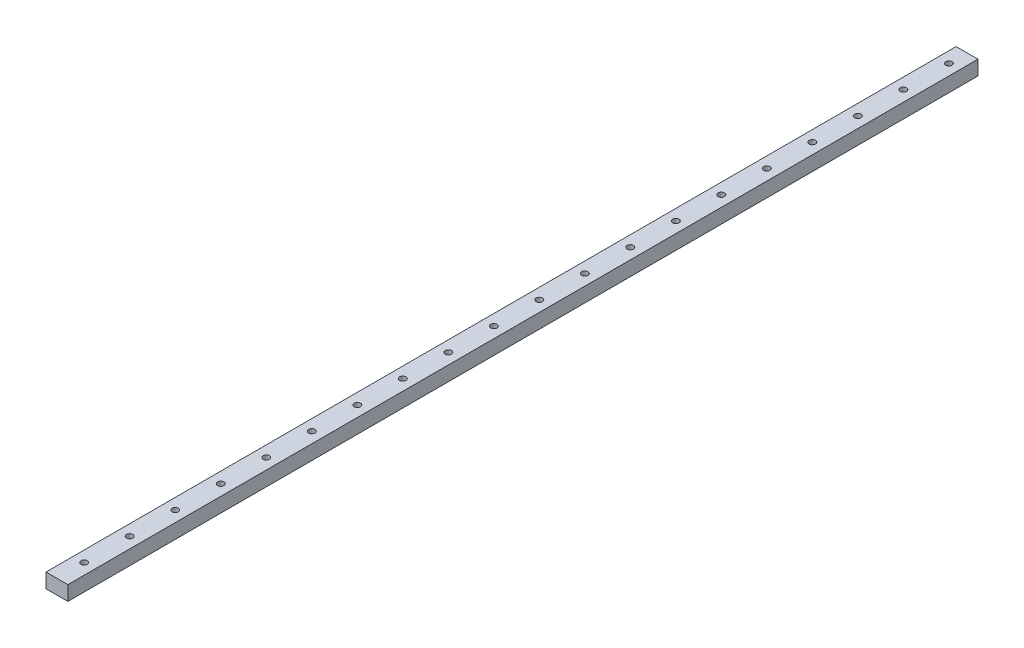
ISO-10303-21;
HEADER;
FILE_DESCRIPTION(('STEP AP214'),'2;1');
FILE_NAME('part.step','',(''),(''),'','','');
FILE_SCHEMA(('AUTOMOTIVE_DESIGN { 1 0 10303 214 1 1 1 1 }'));
ENDSEC;
DATA;
#1=APPLICATION_CONTEXT('core data for automotive mechanical design processes');
#2=APPLICATION_PROTOCOL_DEFINITION('international standard','automotive_design',2000,#1);
#3=PRODUCT_CONTEXT('',#1,'mechanical');
#4=PRODUCT('Part','Part','',(#3));
#5=PRODUCT_RELATED_PRODUCT_CATEGORY('part','',(#4));
#6=PRODUCT_DEFINITION_FORMATION('','',#4);
#7=PRODUCT_DEFINITION_CONTEXT('part definition',#1,'design');
#8=PRODUCT_DEFINITION('design','',#6,#7);
#9=PRODUCT_DEFINITION_SHAPE('','',#8);
#10=(LENGTH_UNIT() NAMED_UNIT(*) SI_UNIT(.MILLI.,.METRE.));
#11=(NAMED_UNIT(*) PLANE_ANGLE_UNIT() SI_UNIT($,.RADIAN.));
#12=(NAMED_UNIT(*) SI_UNIT($,.STERADIAN.) SOLID_ANGLE_UNIT());
#13=UNCERTAINTY_MEASURE_WITH_UNIT(LENGTH_MEASURE(1.E-05),#10,'distance_accuracy_value','');
#14=(GEOMETRIC_REPRESENTATION_CONTEXT(3) GLOBAL_UNCERTAINTY_ASSIGNED_CONTEXT((#13)) GLOBAL_UNIT_ASSIGNED_CONTEXT((#10,
#11,#12)) REPRESENTATION_CONTEXT('',''));
#15=CARTESIAN_POINT('',(0.,0.,0.));
#16=DIRECTION('',(0.,0.,1.));
#17=DIRECTION('',(1.,0.,0.));
#18=AXIS2_PLACEMENT_3D('',#15,#16,#17);
#19=CARTESIAN_POINT('',(0.,-1.,235.));
#20=DIRECTION('',(0.,1.,0.));
#21=DIRECTION('',(-1.,0.,0.));
#22=AXIS2_PLACEMENT_3D('',#19,#20,#21);
#23=CYLINDRICAL_SURFACE('',#22,1.75);
#24=CARTESIAN_POINT('',(0.,8.,235.));
#25=DIRECTION('',(0.,1.,0.));
#26=DIRECTION('',(-1.,0.,0.));
#27=AXIS2_PLACEMENT_3D('',#24,#25,#26);
#28=CIRCLE('',#27,1.75);
#29=CARTESIAN_POINT('',(-1.75,8.,235.));
#30=VERTEX_POINT('',#29);
#31=EDGE_CURVE('E212',#30,#30,#28,.T.);
#32=ORIENTED_EDGE('',*,*,#31,.T.);
#33=EDGE_LOOP('',(#32));
#34=FACE_BOUND('',#33,.T.);
#35=CARTESIAN_POINT('',(0.,0.,235.));
#36=DIRECTION('',(0.,1.,0.));
#37=DIRECTION('',(-1.,0.,0.));
#38=AXIS2_PLACEMENT_3D('',#35,#36,#37);
#39=CIRCLE('',#38,1.75);
#40=CARTESIAN_POINT('',(-1.75,0.,235.));
#41=VERTEX_POINT('',#40);
#42=EDGE_CURVE('E10',#41,#41,#39,.T.);
#43=ORIENTED_EDGE('',*,*,#42,.F.);
#44=EDGE_LOOP('',(#43));
#45=FACE_BOUND('',#44,.T.);
#46=ADVANCED_FACE('F16',(#34,#45),#23,.F.);
#47=CARTESIAN_POINT('',(0.,-1.,210.));
#48=DIRECTION('',(0.,1.,0.));
#49=DIRECTION('',(-1.,0.,0.));
#50=AXIS2_PLACEMENT_3D('',#47,#48,#49);
#51=CYLINDRICAL_SURFACE('',#50,1.75);
#52=CARTESIAN_POINT('',(0.,8.,210.));
#53=DIRECTION('',(0.,1.,0.));
#54=DIRECTION('',(-1.,0.,0.));
#55=AXIS2_PLACEMENT_3D('',#52,#53,#54);
#56=CIRCLE('',#55,1.75);
#57=CARTESIAN_POINT('',(-1.75,8.,210.));
#58=VERTEX_POINT('',#57);
#59=EDGE_CURVE('E202',#58,#58,#56,.T.);
#60=ORIENTED_EDGE('',*,*,#59,.T.);
#61=EDGE_LOOP('',(#60));
#62=FACE_BOUND('',#61,.T.);
#63=CARTESIAN_POINT('',(0.,0.,210.));
#64=DIRECTION('',(0.,1.,0.));
#65=DIRECTION('',(-1.,0.,0.));
#66=AXIS2_PLACEMENT_3D('',#63,#64,#65);
#67=CIRCLE('',#66,1.75);
#68=CARTESIAN_POINT('',(-1.75,0.,210.));
#69=VERTEX_POINT('',#68);
#70=EDGE_CURVE('E24',#69,#69,#67,.T.);
#71=ORIENTED_EDGE('',*,*,#70,.F.);
#72=EDGE_LOOP('',(#71));
#73=FACE_BOUND('',#72,.T.);
#74=ADVANCED_FACE('F291',(#62,#73),#51,.F.);
#75=CARTESIAN_POINT('',(0.,-1.,185.));
#76=DIRECTION('',(0.,1.,0.));
#77=DIRECTION('',(-1.,0.,0.));
#78=AXIS2_PLACEMENT_3D('',#75,#76,#77);
#79=CYLINDRICAL_SURFACE('',#78,1.75);
#80=CARTESIAN_POINT('',(0.,8.,185.));
#81=DIRECTION('',(0.,1.,0.));
#82=DIRECTION('',(-1.,0.,0.));
#83=AXIS2_PLACEMENT_3D('',#80,#81,#82);
#84=CIRCLE('',#83,1.75);
#85=CARTESIAN_POINT('',(-1.75,8.,185.));
#86=VERTEX_POINT('',#85);
#87=EDGE_CURVE('E198',#86,#86,#84,.T.);
#88=ORIENTED_EDGE('',*,*,#87,.T.);
#89=EDGE_LOOP('',(#88));
#90=FACE_BOUND('',#89,.T.);
#91=CARTESIAN_POINT('',(0.,0.,185.));
#92=DIRECTION('',(0.,1.,0.));
#93=DIRECTION('',(-1.,0.,0.));
#94=AXIS2_PLACEMENT_3D('',#91,#92,#93);
#95=CIRCLE('',#94,1.75);
#96=CARTESIAN_POINT('',(-1.75,0.,185.));
#97=VERTEX_POINT('',#96);
#98=EDGE_CURVE('E121',#97,#97,#95,.T.);
#99=ORIENTED_EDGE('',*,*,#98,.F.);
#100=EDGE_LOOP('',(#99));
#101=FACE_BOUND('',#100,.T.);
#102=ADVANCED_FACE('F280',(#90,#101),#79,.F.);
#103=CARTESIAN_POINT('',(0.,-1.,160.));
#104=DIRECTION('',(0.,1.,0.));
#105=DIRECTION('',(-1.,0.,0.));
#106=AXIS2_PLACEMENT_3D('',#103,#104,#105);
#107=CYLINDRICAL_SURFACE('',#106,1.75);
#108=CARTESIAN_POINT('',(0.,8.,160.));
#109=DIRECTION('',(0.,1.,0.));
#110=DIRECTION('',(-1.,0.,0.));
#111=AXIS2_PLACEMENT_3D('',#108,#109,#110);
#112=CIRCLE('',#111,1.75);
#113=CARTESIAN_POINT('',(-1.75,8.,160.));
#114=VERTEX_POINT('',#113);
#115=EDGE_CURVE('E109',#114,#114,#112,.T.);
#116=ORIENTED_EDGE('',*,*,#115,.T.);
#117=EDGE_LOOP('',(#116));
#118=FACE_BOUND('',#117,.T.);
#119=CARTESIAN_POINT('',(0.,0.,160.));
#120=DIRECTION('',(0.,1.,0.));
#121=DIRECTION('',(-1.,0.,0.));
#122=AXIS2_PLACEMENT_3D('',#119,#120,#121);
#123=CIRCLE('',#122,1.75);
#124=CARTESIAN_POINT('',(-1.75,0.,160.));
#125=VERTEX_POINT('',#124);
#126=EDGE_CURVE('E125',#125,#125,#123,.T.);
#127=ORIENTED_EDGE('',*,*,#126,.F.);
#128=EDGE_LOOP('',(#127));
#129=FACE_BOUND('',#128,.T.);
#130=ADVANCED_FACE('F277',(#118,#129),#107,.F.);
#131=CARTESIAN_POINT('',(0.,-1.,135.));
#132=DIRECTION('',(0.,1.,0.));
#133=DIRECTION('',(-1.,0.,0.));
#134=AXIS2_PLACEMENT_3D('',#131,#132,#133);
#135=CYLINDRICAL_SURFACE('',#134,1.75);
#136=CARTESIAN_POINT('',(0.,8.,135.));
#137=DIRECTION('',(0.,1.,0.));
#138=DIRECTION('',(-1.,0.,0.));
#139=AXIS2_PLACEMENT_3D('',#136,#137,#138);
#140=CIRCLE('',#139,1.75);
#141=CARTESIAN_POINT('',(-1.75,8.,135.));
#142=VERTEX_POINT('',#141);
#143=EDGE_CURVE('E107',#142,#142,#140,.T.);
#144=ORIENTED_EDGE('',*,*,#143,.T.);
#145=EDGE_LOOP('',(#144));
#146=FACE_BOUND('',#145,.T.);
#147=CARTESIAN_POINT('',(0.,0.,135.));
#148=DIRECTION('',(0.,1.,0.));
#149=DIRECTION('',(-1.,0.,0.));
#150=AXIS2_PLACEMENT_3D('',#147,#148,#149);
#151=CIRCLE('',#150,1.75);
#152=CARTESIAN_POINT('',(-1.75,0.,135.));
#153=VERTEX_POINT('',#152);
#154=EDGE_CURVE('E266',#153,#153,#151,.T.);
#155=ORIENTED_EDGE('',*,*,#154,.F.);
#156=EDGE_LOOP('',(#155));
#157=FACE_BOUND('',#156,.T.);
#158=ADVANCED_FACE('F279',(#146,#157),#135,.F.);
#159=CARTESIAN_POINT('',(0.,-1.,110.));
#160=DIRECTION('',(0.,1.,0.));
#161=DIRECTION('',(-1.,0.,0.));
#162=AXIS2_PLACEMENT_3D('',#159,#160,#161);
#163=CYLINDRICAL_SURFACE('',#162,1.75);
#164=CARTESIAN_POINT('',(0.,8.,110.));
#165=DIRECTION('',(0.,1.,0.));
#166=DIRECTION('',(-1.,0.,0.));
#167=AXIS2_PLACEMENT_3D('',#164,#165,#166);
#168=CIRCLE('',#167,1.75);
#169=CARTESIAN_POINT('',(-1.75,8.,110.));
#170=VERTEX_POINT('',#169);
#171=EDGE_CURVE('E110',#170,#170,#168,.T.);
#172=ORIENTED_EDGE('',*,*,#171,.T.);
#173=EDGE_LOOP('',(#172));
#174=FACE_BOUND('',#173,.T.);
#175=CARTESIAN_POINT('',(0.,0.,110.));
#176=DIRECTION('',(0.,1.,0.));
#177=DIRECTION('',(-1.,0.,0.));
#178=AXIS2_PLACEMENT_3D('',#175,#176,#177);
#179=CIRCLE('',#178,1.75);
#180=CARTESIAN_POINT('',(-1.75,0.,110.));
#181=VERTEX_POINT('',#180);
#182=EDGE_CURVE('E262',#181,#181,#179,.T.);
#183=ORIENTED_EDGE('',*,*,#182,.F.);
#184=EDGE_LOOP('',(#183));
#185=FACE_BOUND('',#184,.T.);
#186=ADVANCED_FACE('F288',(#174,#185),#163,.F.);
#187=CARTESIAN_POINT('',(0.,-1.,85.));
#188=DIRECTION('',(0.,1.,0.));
#189=DIRECTION('',(-1.,0.,0.));
#190=AXIS2_PLACEMENT_3D('',#187,#188,#189);
#191=CYLINDRICAL_SURFACE('',#190,1.75);
#192=CARTESIAN_POINT('',(0.,8.,85.));
#193=DIRECTION('',(0.,1.,0.));
#194=DIRECTION('',(-1.,0.,0.));
#195=AXIS2_PLACEMENT_3D('',#192,#193,#194);
#196=CIRCLE('',#195,1.75);
#197=CARTESIAN_POINT('',(-1.75,8.,85.));
#198=VERTEX_POINT('',#197);
#199=EDGE_CURVE('E188',#198,#198,#196,.T.);
#200=ORIENTED_EDGE('',*,*,#199,.T.);
#201=EDGE_LOOP('',(#200));
#202=FACE_BOUND('',#201,.T.);
#203=CARTESIAN_POINT('',(0.,0.,85.));
#204=DIRECTION('',(0.,1.,0.));
#205=DIRECTION('',(-1.,0.,0.));
#206=AXIS2_PLACEMENT_3D('',#203,#204,#205);
#207=CIRCLE('',#206,1.75);
#208=CARTESIAN_POINT('',(-1.75,0.,85.));
#209=VERTEX_POINT('',#208);
#210=EDGE_CURVE('E258',#209,#209,#207,.T.);
#211=ORIENTED_EDGE('',*,*,#210,.F.);
#212=EDGE_LOOP('',(#211));
#213=FACE_BOUND('',#212,.T.);
#214=ADVANCED_FACE('F324',(#202,#213),#191,.F.);
#215=CARTESIAN_POINT('',(0.,-1.,60.));
#216=DIRECTION('',(0.,1.,0.));
#217=DIRECTION('',(-1.,0.,0.));
#218=AXIS2_PLACEMENT_3D('',#215,#216,#217);
#219=CYLINDRICAL_SURFACE('',#218,1.75);
#220=CARTESIAN_POINT('',(0.,8.,60.));
#221=DIRECTION('',(0.,1.,0.));
#222=DIRECTION('',(-1.,0.,0.));
#223=AXIS2_PLACEMENT_3D('',#220,#221,#222);
#224=CIRCLE('',#223,1.75);
#225=CARTESIAN_POINT('',(-1.75,8.,60.));
#226=VERTEX_POINT('',#225);
#227=EDGE_CURVE('E184',#226,#226,#224,.T.);
#228=ORIENTED_EDGE('',*,*,#227,.T.);
#229=EDGE_LOOP('',(#228));
#230=FACE_BOUND('',#229,.T.);
#231=CARTESIAN_POINT('',(0.,0.,60.));
#232=DIRECTION('',(0.,1.,0.));
#233=DIRECTION('',(-1.,0.,0.));
#234=AXIS2_PLACEMENT_3D('',#231,#232,#233);
#235=CIRCLE('',#234,1.75);
#236=CARTESIAN_POINT('',(-1.75,0.,60.));
#237=VERTEX_POINT('',#236);
#238=EDGE_CURVE('E257',#237,#237,#235,.T.);
#239=ORIENTED_EDGE('',*,*,#238,.F.);
#240=EDGE_LOOP('',(#239));
#241=FACE_BOUND('',#240,.T.);
#242=ADVANCED_FACE('F327',(#230,#241),#219,.F.);
#243=CARTESIAN_POINT('',(0.,-1.,35.));
#244=DIRECTION('',(0.,1.,0.));
#245=DIRECTION('',(-1.,0.,0.));
#246=AXIS2_PLACEMENT_3D('',#243,#244,#245);
#247=CYLINDRICAL_SURFACE('',#246,1.75);
#248=CARTESIAN_POINT('',(0.,8.,35.));
#249=DIRECTION('',(0.,1.,0.));
#250=DIRECTION('',(-1.,0.,0.));
#251=AXIS2_PLACEMENT_3D('',#248,#249,#250);
#252=CIRCLE('',#251,1.75);
#253=CARTESIAN_POINT('',(-1.75,8.,35.));
#254=VERTEX_POINT('',#253);
#255=EDGE_CURVE('E180',#254,#254,#252,.T.);
#256=ORIENTED_EDGE('',*,*,#255,.T.);
#257=EDGE_LOOP('',(#256));
#258=FACE_BOUND('',#257,.T.);
#259=CARTESIAN_POINT('',(0.,0.,35.));
#260=DIRECTION('',(0.,1.,0.));
#261=DIRECTION('',(-1.,0.,0.));
#262=AXIS2_PLACEMENT_3D('',#259,#260,#261);
#263=CIRCLE('',#262,1.75);
#264=CARTESIAN_POINT('',(-1.75,0.,35.));
#265=VERTEX_POINT('',#264);
#266=EDGE_CURVE('E253',#265,#265,#263,.T.);
#267=ORIENTED_EDGE('',*,*,#266,.F.);
#268=EDGE_LOOP('',(#267));
#269=FACE_BOUND('',#268,.T.);
#270=ADVANCED_FACE('F358',(#258,#269),#247,.F.);
#271=CARTESIAN_POINT('',(0.,-1.,10.));
#272=DIRECTION('',(0.,1.,0.));
#273=DIRECTION('',(-1.,0.,0.));
#274=AXIS2_PLACEMENT_3D('',#271,#272,#273);
#275=CYLINDRICAL_SURFACE('',#274,1.75);
#276=CARTESIAN_POINT('',(0.,8.,10.));
#277=DIRECTION('',(0.,1.,0.));
#278=DIRECTION('',(-1.,0.,0.));
#279=AXIS2_PLACEMENT_3D('',#276,#277,#278);
#280=CIRCLE('',#279,1.75);
#281=CARTESIAN_POINT('',(-1.75,8.,10.));
#282=VERTEX_POINT('',#281);
#283=EDGE_CURVE('E176',#282,#282,#280,.T.);
#284=ORIENTED_EDGE('',*,*,#283,.T.);
#285=EDGE_LOOP('',(#284));
#286=FACE_BOUND('',#285,.T.);
#287=CARTESIAN_POINT('',(0.,0.,10.));
#288=DIRECTION('',(0.,1.,0.));
#289=DIRECTION('',(-1.,0.,0.));
#290=AXIS2_PLACEMENT_3D('',#287,#288,#289);
#291=CIRCLE('',#290,1.75);
#292=CARTESIAN_POINT('',(-1.75,0.,10.));
#293=VERTEX_POINT('',#292);
#294=EDGE_CURVE('E249',#293,#293,#291,.T.);
#295=ORIENTED_EDGE('',*,*,#294,.F.);
#296=EDGE_LOOP('',(#295));
#297=FACE_BOUND('',#296,.T.);
#298=ADVANCED_FACE('F354',(#286,#297),#275,.F.);
#299=CARTESIAN_POINT('',(0.,-1.,-15.));
#300=DIRECTION('',(0.,1.,0.));
#301=DIRECTION('',(-1.,0.,0.));
#302=AXIS2_PLACEMENT_3D('',#299,#300,#301);
#303=CYLINDRICAL_SURFACE('',#302,1.75);
#304=CARTESIAN_POINT('',(0.,8.,-15.));
#305=DIRECTION('',(0.,1.,0.));
#306=DIRECTION('',(-1.,0.,0.));
#307=AXIS2_PLACEMENT_3D('',#304,#305,#306);
#308=CIRCLE('',#307,1.75);
#309=CARTESIAN_POINT('',(-1.75,8.,-15.));
#310=VERTEX_POINT('',#309);
#311=EDGE_CURVE('E172',#310,#310,#308,.T.);
#312=ORIENTED_EDGE('',*,*,#311,.T.);
#313=EDGE_LOOP('',(#312));
#314=FACE_BOUND('',#313,.T.);
#315=CARTESIAN_POINT('',(0.,0.,-15.));
#316=DIRECTION('',(0.,1.,0.));
#317=DIRECTION('',(-1.,0.,0.));
#318=AXIS2_PLACEMENT_3D('',#315,#316,#317);
#319=CIRCLE('',#318,1.75);
#320=CARTESIAN_POINT('',(-1.75,0.,-15.));
#321=VERTEX_POINT('',#320);
#322=EDGE_CURVE('E207',#321,#321,#319,.T.);
#323=ORIENTED_EDGE('',*,*,#322,.F.);
#324=EDGE_LOOP('',(#323));
#325=FACE_BOUND('',#324,.T.);
#326=ADVANCED_FACE('F350',(#314,#325),#303,.F.);
#327=CARTESIAN_POINT('',(0.,-1.,-40.));
#328=DIRECTION('',(0.,1.,0.));
#329=DIRECTION('',(-1.,0.,0.));
#330=AXIS2_PLACEMENT_3D('',#327,#328,#329);
#331=CYLINDRICAL_SURFACE('',#330,1.75);
#332=CARTESIAN_POINT('',(0.,8.,-40.));
#333=DIRECTION('',(0.,1.,0.));
#334=DIRECTION('',(-1.,0.,0.));
#335=AXIS2_PLACEMENT_3D('',#332,#333,#334);
#336=CIRCLE('',#335,1.75);
#337=CARTESIAN_POINT('',(-1.75,8.,-40.));
#338=VERTEX_POINT('',#337);
#339=EDGE_CURVE('E168',#338,#338,#336,.T.);
#340=ORIENTED_EDGE('',*,*,#339,.T.);
#341=EDGE_LOOP('',(#340));
#342=FACE_BOUND('',#341,.T.);
#343=CARTESIAN_POINT('',(0.,0.,-40.));
#344=DIRECTION('',(0.,1.,0.));
#345=DIRECTION('',(-1.,0.,0.));
#346=AXIS2_PLACEMENT_3D('',#343,#344,#345);
#347=CIRCLE('',#346,1.75);
#348=CARTESIAN_POINT('',(-1.75,0.,-40.));
#349=VERTEX_POINT('',#348);
#350=EDGE_CURVE('E203',#349,#349,#347,.T.);
#351=ORIENTED_EDGE('',*,*,#350,.F.);
#352=EDGE_LOOP('',(#351));
#353=FACE_BOUND('',#352,.T.);
#354=ADVANCED_FACE('F346',(#342,#353),#331,.F.);
#355=CARTESIAN_POINT('',(0.,-1.,-65.));
#356=DIRECTION('',(0.,1.,0.));
#357=DIRECTION('',(-1.,0.,0.));
#358=AXIS2_PLACEMENT_3D('',#355,#356,#357);
#359=CYLINDRICAL_SURFACE('',#358,1.75);
#360=CARTESIAN_POINT('',(0.,8.,-65.));
#361=DIRECTION('',(0.,1.,0.));
#362=DIRECTION('',(-1.,0.,0.));
#363=AXIS2_PLACEMENT_3D('',#360,#361,#362);
#364=CIRCLE('',#363,1.75);
#365=CARTESIAN_POINT('',(-1.75,8.,-65.));
#366=VERTEX_POINT('',#365);
#367=EDGE_CURVE('E139',#366,#366,#364,.T.);
#368=ORIENTED_EDGE('',*,*,#367,.T.);
#369=EDGE_LOOP('',(#368));
#370=FACE_BOUND('',#369,.T.);
#371=CARTESIAN_POINT('',(0.,0.,-65.));
#372=DIRECTION('',(0.,1.,0.));
#373=DIRECTION('',(-1.,0.,0.));
#374=AXIS2_PLACEMENT_3D('',#371,#372,#373);
#375=CIRCLE('',#374,1.75);
#376=CARTESIAN_POINT('',(-1.75,0.,-65.));
#377=VERTEX_POINT('',#376);
#378=EDGE_CURVE('E208',#377,#377,#375,.T.);
#379=ORIENTED_EDGE('',*,*,#378,.F.);
#380=EDGE_LOOP('',(#379));
#381=FACE_BOUND('',#380,.T.);
#382=ADVANCED_FACE('F349',(#370,#381),#359,.F.);
#383=CARTESIAN_POINT('',(0.,-1.,-90.));
#384=DIRECTION('',(0.,1.,0.));
#385=DIRECTION('',(-1.,0.,0.));
#386=AXIS2_PLACEMENT_3D('',#383,#384,#385);
#387=CYLINDRICAL_SURFACE('',#386,1.75);
#388=CARTESIAN_POINT('',(0.,8.,-90.));
#389=DIRECTION('',(0.,1.,0.));
#390=DIRECTION('',(-1.,0.,0.));
#391=AXIS2_PLACEMENT_3D('',#388,#389,#390);
#392=CIRCLE('',#391,1.75);
#393=CARTESIAN_POINT('',(-1.75,8.,-90.));
#394=VERTEX_POINT('',#393);
#395=EDGE_CURVE('E135',#394,#394,#392,.T.);
#396=ORIENTED_EDGE('',*,*,#395,.T.);
#397=EDGE_LOOP('',(#396));
#398=FACE_BOUND('',#397,.T.);
#399=CARTESIAN_POINT('',(0.,0.,-90.));
#400=DIRECTION('',(0.,1.,0.));
#401=DIRECTION('',(-1.,0.,0.));
#402=AXIS2_PLACEMENT_3D('',#399,#400,#401);
#403=CIRCLE('',#402,1.75);
#404=CARTESIAN_POINT('',(-1.75,0.,-90.));
#405=VERTEX_POINT('',#404);
#406=EDGE_CURVE('E130',#405,#405,#403,.T.);
#407=ORIENTED_EDGE('',*,*,#406,.F.);
#408=EDGE_LOOP('',(#407));
#409=FACE_BOUND('',#408,.T.);
#410=ADVANCED_FACE('F411',(#398,#409),#387,.F.);
#411=CARTESIAN_POINT('',(0.,-1.,-115.));
#412=DIRECTION('',(0.,1.,0.));
#413=DIRECTION('',(-1.,0.,0.));
#414=AXIS2_PLACEMENT_3D('',#411,#412,#413);
#415=CYLINDRICAL_SURFACE('',#414,1.75);
#416=CARTESIAN_POINT('',(0.,8.,-115.));
#417=DIRECTION('',(0.,1.,0.));
#418=DIRECTION('',(-1.,0.,0.));
#419=AXIS2_PLACEMENT_3D('',#416,#417,#418);
#420=CIRCLE('',#419,1.75);
#421=CARTESIAN_POINT('',(-1.75,8.,-115.));
#422=VERTEX_POINT('',#421);
#423=EDGE_CURVE('E140',#422,#422,#420,.T.);
#424=ORIENTED_EDGE('',*,*,#423,.T.);
#425=EDGE_LOOP('',(#424));
#426=FACE_BOUND('',#425,.T.);
#427=CARTESIAN_POINT('',(0.,0.,-115.));
#428=DIRECTION('',(0.,1.,0.));
#429=DIRECTION('',(-1.,0.,0.));
#430=AXIS2_PLACEMENT_3D('',#427,#428,#429);
#431=CIRCLE('',#430,1.75);
#432=CARTESIAN_POINT('',(-1.75,0.,-115.));
#433=VERTEX_POINT('',#432);
#434=EDGE_CURVE('E126',#433,#433,#431,.T.);
#435=ORIENTED_EDGE('',*,*,#434,.F.);
#436=EDGE_LOOP('',(#435));
#437=FACE_BOUND('',#436,.T.);
#438=ADVANCED_FACE('F344',(#426,#437),#415,.F.);
#439=CARTESIAN_POINT('',(0.,-1.,-140.));
#440=DIRECTION('',(0.,1.,0.));
#441=DIRECTION('',(-1.,0.,0.));
#442=AXIS2_PLACEMENT_3D('',#439,#440,#441);
#443=CYLINDRICAL_SURFACE('',#442,1.75);
#444=CARTESIAN_POINT('',(0.,8.,-140.));
#445=DIRECTION('',(0.,1.,0.));
#446=DIRECTION('',(-1.,0.,0.));
#447=AXIS2_PLACEMENT_3D('',#444,#445,#446);
#448=CIRCLE('',#447,1.75);
#449=CARTESIAN_POINT('',(-1.75,8.,-140.));
#450=VERTEX_POINT('',#449);
#451=EDGE_CURVE('E105',#450,#450,#448,.T.);
#452=ORIENTED_EDGE('',*,*,#451,.T.);
#453=EDGE_LOOP('',(#452));
#454=FACE_BOUND('',#453,.T.);
#455=CARTESIAN_POINT('',(0.,0.,-140.));
#456=DIRECTION('',(0.,1.,0.));
#457=DIRECTION('',(-1.,0.,0.));
#458=AXIS2_PLACEMENT_3D('',#455,#456,#457);
#459=CIRCLE('',#458,1.75);
#460=CARTESIAN_POINT('',(-1.75,0.,-140.));
#461=VERTEX_POINT('',#460);
#462=EDGE_CURVE('E131',#461,#461,#459,.T.);
#463=ORIENTED_EDGE('',*,*,#462,.F.);
#464=EDGE_LOOP('',(#463));
#465=FACE_BOUND('',#464,.T.);
#466=ADVANCED_FACE('F340',(#454,#465),#443,.F.);
#467=CARTESIAN_POINT('',(0.,-1.,-165.));
#468=DIRECTION('',(0.,1.,0.));
#469=DIRECTION('',(-1.,0.,0.));
#470=AXIS2_PLACEMENT_3D('',#467,#468,#469);
#471=CYLINDRICAL_SURFACE('',#470,1.75);
#472=CARTESIAN_POINT('',(0.,8.,-165.));
#473=DIRECTION('',(0.,1.,0.));
#474=DIRECTION('',(-1.,0.,0.));
#475=AXIS2_PLACEMENT_3D('',#472,#473,#474);
#476=CIRCLE('',#475,1.75);
#477=CARTESIAN_POINT('',(-1.75,8.,-165.));
#478=VERTEX_POINT('',#477);
#479=EDGE_CURVE('E112',#478,#478,#476,.T.);
#480=ORIENTED_EDGE('',*,*,#479,.T.);
#481=EDGE_LOOP('',(#480));
#482=FACE_BOUND('',#481,.T.);
#483=CARTESIAN_POINT('',(0.,0.,-165.));
#484=DIRECTION('',(0.,1.,0.));
#485=DIRECTION('',(-1.,0.,0.));
#486=AXIS2_PLACEMENT_3D('',#483,#484,#485);
#487=CIRCLE('',#486,1.75);
#488=CARTESIAN_POINT('',(-1.75,0.,-165.));
#489=VERTEX_POINT('',#488);
#490=EDGE_CURVE('E233',#489,#489,#487,.T.);
#491=ORIENTED_EDGE('',*,*,#490,.F.);
#492=EDGE_LOOP('',(#491));
#493=FACE_BOUND('',#492,.T.);
#494=ADVANCED_FACE('F336',(#482,#493),#471,.F.);
#495=CARTESIAN_POINT('',(0.,-1.,-190.));
#496=DIRECTION('',(0.,1.,0.));
#497=DIRECTION('',(-1.,0.,0.));
#498=AXIS2_PLACEMENT_3D('',#495,#496,#497);
#499=CYLINDRICAL_SURFACE('',#498,1.75);
#500=CARTESIAN_POINT('',(0.,8.,-190.));
#501=DIRECTION('',(0.,1.,0.));
#502=DIRECTION('',(-1.,0.,0.));
#503=AXIS2_PLACEMENT_3D('',#500,#501,#502);
#504=CIRCLE('',#503,1.75);
#505=CARTESIAN_POINT('',(-1.75,8.,-190.));
#506=VERTEX_POINT('',#505);
#507=EDGE_CURVE('E116',#506,#506,#504,.T.);
#508=ORIENTED_EDGE('',*,*,#507,.T.);
#509=EDGE_LOOP('',(#508));
#510=FACE_BOUND('',#509,.T.);
#511=CARTESIAN_POINT('',(0.,0.,-190.));
#512=DIRECTION('',(0.,1.,0.));
#513=DIRECTION('',(-1.,0.,0.));
#514=AXIS2_PLACEMENT_3D('',#511,#512,#513);
#515=CIRCLE('',#514,1.75);
#516=CARTESIAN_POINT('',(-1.75,0.,-190.));
#517=VERTEX_POINT('',#516);
#518=EDGE_CURVE('E229',#517,#517,#515,.T.);
#519=ORIENTED_EDGE('',*,*,#518,.F.);
#520=EDGE_LOOP('',(#519));
#521=FACE_BOUND('',#520,.T.);
#522=ADVANCED_FACE('F332',(#510,#521),#499,.F.);
#523=CARTESIAN_POINT('',(0.,-1.,-215.));
#524=DIRECTION('',(0.,1.,0.));
#525=DIRECTION('',(-1.,0.,0.));
#526=AXIS2_PLACEMENT_3D('',#523,#524,#525);
#527=CYLINDRICAL_SURFACE('',#526,1.75);
#528=CARTESIAN_POINT('',(0.,8.,-215.));
#529=DIRECTION('',(0.,1.,0.));
#530=DIRECTION('',(-1.,0.,0.));
#531=AXIS2_PLACEMENT_3D('',#528,#529,#530);
#532=CIRCLE('',#531,1.75);
#533=CARTESIAN_POINT('',(-1.75,8.,-215.));
#534=VERTEX_POINT('',#533);
#535=EDGE_CURVE('E146',#534,#534,#532,.T.);
#536=ORIENTED_EDGE('',*,*,#535,.T.);
#537=EDGE_LOOP('',(#536));
#538=FACE_BOUND('',#537,.T.);
#539=CARTESIAN_POINT('',(0.,0.,-215.));
#540=DIRECTION('',(0.,1.,0.));
#541=DIRECTION('',(-1.,0.,0.));
#542=AXIS2_PLACEMENT_3D('',#539,#540,#541);
#543=CIRCLE('',#542,1.75);
#544=CARTESIAN_POINT('',(-1.75,0.,-215.));
#545=VERTEX_POINT('',#544);
#546=EDGE_CURVE('E225',#545,#545,#543,.T.);
#547=ORIENTED_EDGE('',*,*,#546,.F.);
#548=EDGE_LOOP('',(#547));
#549=FACE_BOUND('',#548,.T.);
#550=ADVANCED_FACE('F329',(#538,#549),#527,.F.);
#551=CARTESIAN_POINT('',(0.,-1.,-240.));
#552=DIRECTION('',(0.,1.,0.));
#553=DIRECTION('',(-1.,0.,0.));
#554=AXIS2_PLACEMENT_3D('',#551,#552,#553);
#555=CYLINDRICAL_SURFACE('',#554,1.75);
#556=CARTESIAN_POINT('',(0.,8.,-240.));
#557=DIRECTION('',(0.,1.,0.));
#558=DIRECTION('',(-1.,0.,0.));
#559=AXIS2_PLACEMENT_3D('',#556,#557,#558);
#560=CIRCLE('',#559,1.75);
#561=CARTESIAN_POINT('',(-1.75,8.,-240.));
#562=VERTEX_POINT('',#561);
#563=EDGE_CURVE('E145',#562,#562,#560,.T.);
#564=ORIENTED_EDGE('',*,*,#563,.T.);
#565=EDGE_LOOP('',(#564));
#566=FACE_BOUND('',#565,.T.);
#567=CARTESIAN_POINT('',(0.,0.,-240.));
#568=DIRECTION('',(0.,1.,0.));
#569=DIRECTION('',(-1.,0.,0.));
#570=AXIS2_PLACEMENT_3D('',#567,#568,#569);
#571=CIRCLE('',#570,1.75);
#572=CARTESIAN_POINT('',(-1.75,0.,-240.));
#573=VERTEX_POINT('',#572);
#574=EDGE_CURVE('E221',#573,#573,#571,.T.);
#575=ORIENTED_EDGE('',*,*,#574,.F.);
#576=EDGE_LOOP('',(#575));
#577=FACE_BOUND('',#576,.T.);
#578=ADVANCED_FACE('F320',(#566,#577),#555,.F.);
#579=CARTESIAN_POINT('',(-6.,0.,-250.));
#580=DIRECTION('',(-1.,0.,0.));
#581=DIRECTION('',(0.,0.,1.));
#582=AXIS2_PLACEMENT_3D('',#579,#580,#581);
#583=PLANE('',#582);
#584=DIRECTION('',(0.,1.,0.));
#585=VECTOR('',#584,1.);
#586=CARTESIAN_POINT('',(-6.,0.,-250.));
#587=LINE('',#586,#585);
#588=CARTESIAN_POINT('',(-6.,0.,-250.));
#589=VERTEX_POINT('',#588);
#590=CARTESIAN_POINT('',(-6.,8.,-250.));
#591=VERTEX_POINT('',#590);
#592=EDGE_CURVE('E76',#589,#591,#587,.T.);
#593=ORIENTED_EDGE('',*,*,#592,.F.);
#594=DIRECTION('',(0.,0.,1.));
#595=VECTOR('',#594,1.);
#596=CARTESIAN_POINT('',(-6.,0.,-250.));
#597=LINE('',#596,#595);
#598=CARTESIAN_POINT('',(-6.,0.,250.));
#599=VERTEX_POINT('',#598);
#600=EDGE_CURVE('E36',#589,#599,#597,.T.);
#601=ORIENTED_EDGE('',*,*,#600,.T.);
#602=DIRECTION('',(0.,1.,0.));
#603=VECTOR('',#602,1.);
#604=CARTESIAN_POINT('',(-6.,0.,250.));
#605=LINE('',#604,#603);
#606=CARTESIAN_POINT('',(-6.,8.,250.));
#607=VERTEX_POINT('',#606);
#608=EDGE_CURVE('E42',#599,#607,#605,.T.);
#609=ORIENTED_EDGE('',*,*,#608,.T.);
#610=DIRECTION('',(0.,0.,1.));
#611=VECTOR('',#610,1.);
#612=CARTESIAN_POINT('',(-6.,8.,-250.));
#613=LINE('',#612,#611);
#614=EDGE_CURVE('E133',#591,#607,#613,.T.);
#615=ORIENTED_EDGE('',*,*,#614,.F.);
#616=EDGE_LOOP('',(#593,#601,#609,#615));
#617=FACE_BOUND('',#616,.T.);
#618=ADVANCED_FACE('F307',(#617),#583,.T.);
#619=CARTESIAN_POINT('',(6.,0.,-250.));
#620=DIRECTION('',(0.,1.,0.));
#621=DIRECTION('',(1.,0.,0.));
#622=AXIS2_PLACEMENT_3D('',#619,#620,#621);
#623=PLANE('',#622);
#624=ORIENTED_EDGE('',*,*,#42,.T.);
#625=EDGE_LOOP('',(#624));
#626=FACE_BOUND('',#625,.T.);
#627=ORIENTED_EDGE('',*,*,#70,.T.);
#628=EDGE_LOOP('',(#627));
#629=FACE_BOUND('',#628,.T.);
#630=ORIENTED_EDGE('',*,*,#98,.T.);
#631=EDGE_LOOP('',(#630));
#632=FACE_BOUND('',#631,.T.);
#633=ORIENTED_EDGE('',*,*,#126,.T.);
#634=EDGE_LOOP('',(#633));
#635=FACE_BOUND('',#634,.T.);
#636=ORIENTED_EDGE('',*,*,#154,.T.);
#637=EDGE_LOOP('',(#636));
#638=FACE_BOUND('',#637,.T.);
#639=ORIENTED_EDGE('',*,*,#182,.T.);
#640=EDGE_LOOP('',(#639));
#641=FACE_BOUND('',#640,.T.);
#642=ORIENTED_EDGE('',*,*,#210,.T.);
#643=EDGE_LOOP('',(#642));
#644=FACE_BOUND('',#643,.T.);
#645=ORIENTED_EDGE('',*,*,#238,.T.);
#646=EDGE_LOOP('',(#645));
#647=FACE_BOUND('',#646,.T.);
#648=ORIENTED_EDGE('',*,*,#266,.T.);
#649=EDGE_LOOP('',(#648));
#650=FACE_BOUND('',#649,.T.);
#651=ORIENTED_EDGE('',*,*,#294,.T.);
#652=EDGE_LOOP('',(#651));
#653=FACE_BOUND('',#652,.T.);
#654=ORIENTED_EDGE('',*,*,#322,.T.);
#655=EDGE_LOOP('',(#654));
#656=FACE_BOUND('',#655,.T.);
#657=ORIENTED_EDGE('',*,*,#350,.T.);
#658=EDGE_LOOP('',(#657));
#659=FACE_BOUND('',#658,.T.);
#660=ORIENTED_EDGE('',*,*,#378,.T.);
#661=EDGE_LOOP('',(#660));
#662=FACE_BOUND('',#661,.T.);
#663=ORIENTED_EDGE('',*,*,#406,.T.);
#664=EDGE_LOOP('',(#663));
#665=FACE_BOUND('',#664,.T.);
#666=ORIENTED_EDGE('',*,*,#434,.T.);
#667=EDGE_LOOP('',(#666));
#668=FACE_BOUND('',#667,.T.);
#669=ORIENTED_EDGE('',*,*,#462,.T.);
#670=EDGE_LOOP('',(#669));
#671=FACE_BOUND('',#670,.T.);
#672=ORIENTED_EDGE('',*,*,#490,.T.);
#673=EDGE_LOOP('',(#672));
#674=FACE_BOUND('',#673,.T.);
#675=ORIENTED_EDGE('',*,*,#518,.T.);
#676=EDGE_LOOP('',(#675));
#677=FACE_BOUND('',#676,.T.);
#678=ORIENTED_EDGE('',*,*,#546,.T.);
#679=EDGE_LOOP('',(#678));
#680=FACE_BOUND('',#679,.T.);
#681=ORIENTED_EDGE('',*,*,#574,.T.);
#682=EDGE_LOOP('',(#681));
#683=FACE_BOUND('',#682,.T.);
#684=DIRECTION('',(-1.,0.,0.));
#685=VECTOR('',#684,1.);
#686=CARTESIAN_POINT('',(6.,0.,250.));
#687=LINE('',#686,#685);
#688=CARTESIAN_POINT('',(6.,0.,250.));
#689=VERTEX_POINT('',#688);
#690=EDGE_CURVE('E155',#689,#599,#687,.T.);
#691=ORIENTED_EDGE('',*,*,#690,.T.);
#692=ORIENTED_EDGE('',*,*,#600,.F.);
#693=DIRECTION('',(-1.,0.,0.));
#694=VECTOR('',#693,1.);
#695=CARTESIAN_POINT('',(6.,0.,-250.));
#696=LINE('',#695,#694);
#697=CARTESIAN_POINT('',(6.,0.,-250.));
#698=VERTEX_POINT('',#697);
#699=EDGE_CURVE('E81',#698,#589,#696,.T.);
#700=ORIENTED_EDGE('',*,*,#699,.F.);
#701=DIRECTION('',(0.,0.,1.));
#702=VECTOR('',#701,1.);
#703=CARTESIAN_POINT('',(6.,0.,-250.));
#704=LINE('',#703,#702);
#705=EDGE_CURVE('E89',#698,#689,#704,.T.);
#706=ORIENTED_EDGE('',*,*,#705,.T.);
#707=EDGE_LOOP('',(#691,#692,#700,#706));
#708=FACE_BOUND('',#707,.T.);
#709=ADVANCED_FACE('F274',(#626,#629,#632,#635,#638,#641,#644,#647,#650,#653,#656,#659,#662,
#665,#668,#671,#674,#677,#680,#683,#708),#623,.F.);
#710=CARTESIAN_POINT('',(6.,0.,250.));
#711=DIRECTION('',(0.,0.,1.));
#712=DIRECTION('',(0.,-1.,0.));
#713=AXIS2_PLACEMENT_3D('',#710,#711,#712);
#714=PLANE('',#713);
#715=ORIENTED_EDGE('',*,*,#690,.F.);
#716=DIRECTION('',(0.,1.,0.));
#717=VECTOR('',#716,1.);
#718=CARTESIAN_POINT('',(6.,0.,250.));
#719=LINE('',#718,#717);
#720=CARTESIAN_POINT('',(6.,8.,250.));
#721=VERTEX_POINT('',#720);
#722=EDGE_CURVE('E96',#689,#721,#719,.T.);
#723=ORIENTED_EDGE('',*,*,#722,.T.);
#724=DIRECTION('',(-1.,0.,0.));
#725=VECTOR('',#724,1.);
#726=CARTESIAN_POINT('',(6.,8.,250.));
#727=LINE('',#726,#725);
#728=EDGE_CURVE('E93',#721,#607,#727,.T.);
#729=ORIENTED_EDGE('',*,*,#728,.T.);
#730=ORIENTED_EDGE('',*,*,#608,.F.);
#731=EDGE_LOOP('',(#715,#723,#729,#730));
#732=FACE_BOUND('',#731,.T.);
#733=ADVANCED_FACE('F306',(#732),#714,.T.);
#734=CARTESIAN_POINT('',(6.,8.,-250.));
#735=DIRECTION('',(0.,1.,0.));
#736=DIRECTION('',(1.,0.,0.));
#737=AXIS2_PLACEMENT_3D('',#734,#735,#736);
#738=PLANE('',#737);
#739=ORIENTED_EDGE('',*,*,#31,.F.);
#740=EDGE_LOOP('',(#739));
#741=FACE_BOUND('',#740,.T.);
#742=ORIENTED_EDGE('',*,*,#59,.F.);
#743=EDGE_LOOP('',(#742));
#744=FACE_BOUND('',#743,.T.);
#745=ORIENTED_EDGE('',*,*,#87,.F.);
#746=EDGE_LOOP('',(#745));
#747=FACE_BOUND('',#746,.T.);
#748=ORIENTED_EDGE('',*,*,#115,.F.);
#749=EDGE_LOOP('',(#748));
#750=FACE_BOUND('',#749,.T.);
#751=ORIENTED_EDGE('',*,*,#143,.F.);
#752=EDGE_LOOP('',(#751));
#753=FACE_BOUND('',#752,.T.);
#754=ORIENTED_EDGE('',*,*,#171,.F.);
#755=EDGE_LOOP('',(#754));
#756=FACE_BOUND('',#755,.T.);
#757=ORIENTED_EDGE('',*,*,#199,.F.);
#758=EDGE_LOOP('',(#757));
#759=FACE_BOUND('',#758,.T.);
#760=ORIENTED_EDGE('',*,*,#227,.F.);
#761=EDGE_LOOP('',(#760));
#762=FACE_BOUND('',#761,.T.);
#763=ORIENTED_EDGE('',*,*,#255,.F.);
#764=EDGE_LOOP('',(#763));
#765=FACE_BOUND('',#764,.T.);
#766=ORIENTED_EDGE('',*,*,#283,.F.);
#767=EDGE_LOOP('',(#766));
#768=FACE_BOUND('',#767,.T.);
#769=ORIENTED_EDGE('',*,*,#311,.F.);
#770=EDGE_LOOP('',(#769));
#771=FACE_BOUND('',#770,.T.);
#772=ORIENTED_EDGE('',*,*,#339,.F.);
#773=EDGE_LOOP('',(#772));
#774=FACE_BOUND('',#773,.T.);
#775=ORIENTED_EDGE('',*,*,#367,.F.);
#776=EDGE_LOOP('',(#775));
#777=FACE_BOUND('',#776,.T.);
#778=ORIENTED_EDGE('',*,*,#395,.F.);
#779=EDGE_LOOP('',(#778));
#780=FACE_BOUND('',#779,.T.);
#781=ORIENTED_EDGE('',*,*,#423,.F.);
#782=EDGE_LOOP('',(#781));
#783=FACE_BOUND('',#782,.T.);
#784=ORIENTED_EDGE('',*,*,#451,.F.);
#785=EDGE_LOOP('',(#784));
#786=FACE_BOUND('',#785,.T.);
#787=ORIENTED_EDGE('',*,*,#479,.F.);
#788=EDGE_LOOP('',(#787));
#789=FACE_BOUND('',#788,.T.);
#790=ORIENTED_EDGE('',*,*,#507,.F.);
#791=EDGE_LOOP('',(#790));
#792=FACE_BOUND('',#791,.T.);
#793=ORIENTED_EDGE('',*,*,#535,.F.);
#794=EDGE_LOOP('',(#793));
#795=FACE_BOUND('',#794,.T.);
#796=ORIENTED_EDGE('',*,*,#563,.F.);
#797=EDGE_LOOP('',(#796));
#798=FACE_BOUND('',#797,.T.);
#799=DIRECTION('',(0.,0.,1.));
#800=VECTOR('',#799,1.);
#801=CARTESIAN_POINT('',(6.,8.,-250.));
#802=LINE('',#801,#800);
#803=CARTESIAN_POINT('',(6.,8.,-250.));
#804=VERTEX_POINT('',#803);
#805=EDGE_CURVE('E87',#804,#721,#802,.T.);
#806=ORIENTED_EDGE('',*,*,#805,.F.);
#807=DIRECTION('',(-1.,0.,0.));
#808=VECTOR('',#807,1.);
#809=CARTESIAN_POINT('',(6.,8.,-250.));
#810=LINE('',#809,#808);
#811=EDGE_CURVE('E70',#804,#591,#810,.T.);
#812=ORIENTED_EDGE('',*,*,#811,.T.);
#813=ORIENTED_EDGE('',*,*,#614,.T.);
#814=ORIENTED_EDGE('',*,*,#728,.F.);
#815=EDGE_LOOP('',(#806,#812,#813,#814));
#816=FACE_BOUND('',#815,.T.);
#817=ADVANCED_FACE('F92',(#741,#744,#747,#750,#753,#756,#759,#762,#765,#768,#771,#774,#777,#780,
#783,#786,#789,#792,#795,#798,#816),#738,.T.);
#818=CARTESIAN_POINT('',(6.,0.,-250.));
#819=DIRECTION('',(0.,0.,1.));
#820=DIRECTION('',(0.,-1.,0.));
#821=AXIS2_PLACEMENT_3D('',#818,#819,#820);
#822=PLANE('',#821);
#823=ORIENTED_EDGE('',*,*,#592,.T.);
#824=ORIENTED_EDGE('',*,*,#811,.F.);
#825=DIRECTION('',(0.,1.,0.));
#826=VECTOR('',#825,1.);
#827=CARTESIAN_POINT('',(6.,0.,-250.));
#828=LINE('',#827,#826);
#829=EDGE_CURVE('E74',#698,#804,#828,.T.);
#830=ORIENTED_EDGE('',*,*,#829,.F.);
#831=ORIENTED_EDGE('',*,*,#699,.T.);
#832=EDGE_LOOP('',(#823,#824,#830,#831));
#833=FACE_BOUND('',#832,.T.);
#834=ADVANCED_FACE('F72',(#833),#822,.F.);
#835=CARTESIAN_POINT('',(6.,0.,-250.));
#836=DIRECTION('',(-1.,0.,0.));
#837=DIRECTION('',(0.,0.,1.));
#838=AXIS2_PLACEMENT_3D('',#835,#836,#837);
#839=PLANE('',#838);
#840=ORIENTED_EDGE('',*,*,#805,.T.);
#841=ORIENTED_EDGE('',*,*,#722,.F.);
#842=ORIENTED_EDGE('',*,*,#705,.F.);
#843=ORIENTED_EDGE('',*,*,#829,.T.);
#844=EDGE_LOOP('',(#840,#841,#842,#843));
#845=FACE_BOUND('',#844,.T.);
#846=ADVANCED_FACE('F85',(#845),#839,.F.);
#847=CLOSED_SHELL('',(#46,#74,#102,#130,#158,#186,#214,#242,#270,#298,#326,#354,#382,#410,#438,
#466,#494,#522,#550,#578,#618,#709,#733,#817,#834,#846));
#848=MANIFOLD_SOLID_BREP('B1',#847);
#849=ADVANCED_BREP_SHAPE_REPRESENTATION('',(#18,#848),#14);
#850=SHAPE_DEFINITION_REPRESENTATION(#9,#849);
ENDSEC;
END-ISO-10303-21;
